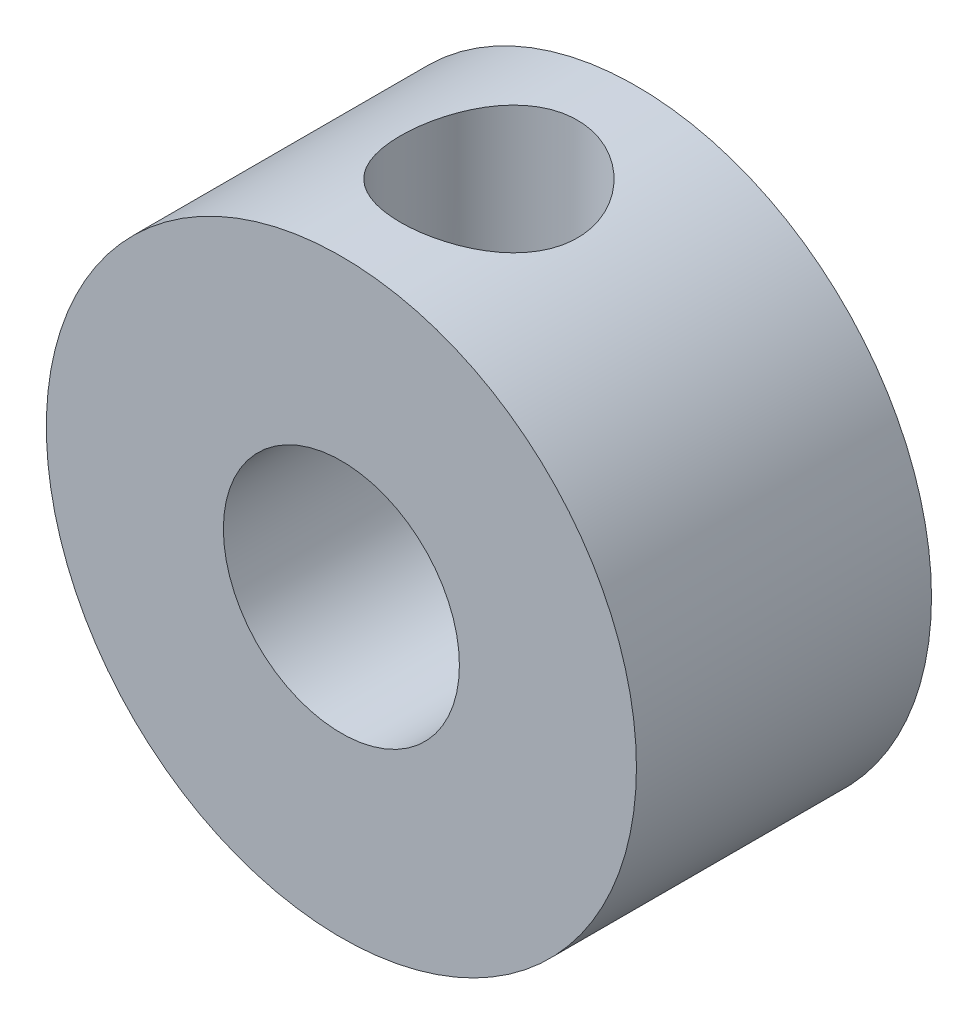
ISO-10303-21;
HEADER;
FILE_DESCRIPTION(('STEP AP214'),'2;1');
FILE_NAME('part.step','',(''),(''),'','','');
FILE_SCHEMA(('AUTOMOTIVE_DESIGN { 1 0 10303 214 1 1 1 1 }'));
ENDSEC;
DATA;
#1=APPLICATION_CONTEXT('core data for automotive mechanical design processes');
#2=APPLICATION_PROTOCOL_DEFINITION('international standard','automotive_design',2000,#1);
#3=PRODUCT_CONTEXT('',#1,'mechanical');
#4=PRODUCT('Part','Part','',(#3));
#5=PRODUCT_RELATED_PRODUCT_CATEGORY('part','',(#4));
#6=PRODUCT_DEFINITION_FORMATION('','',#4);
#7=PRODUCT_DEFINITION_CONTEXT('part definition',#1,'design');
#8=PRODUCT_DEFINITION('design','',#6,#7);
#9=PRODUCT_DEFINITION_SHAPE('','',#8);
#10=(LENGTH_UNIT() NAMED_UNIT(*) SI_UNIT(.MILLI.,.METRE.));
#11=(NAMED_UNIT(*) PLANE_ANGLE_UNIT() SI_UNIT($,.RADIAN.));
#12=(NAMED_UNIT(*) SI_UNIT($,.STERADIAN.) SOLID_ANGLE_UNIT());
#13=UNCERTAINTY_MEASURE_WITH_UNIT(LENGTH_MEASURE(1.E-05),#10,'distance_accuracy_value','');
#14=(GEOMETRIC_REPRESENTATION_CONTEXT(3) GLOBAL_UNCERTAINTY_ASSIGNED_CONTEXT((#13)) GLOBAL_UNIT_ASSIGNED_CONTEXT((#10,
#11,#12)) REPRESENTATION_CONTEXT('',''));
#15=CARTESIAN_POINT('',(0.,0.,0.));
#16=DIRECTION('',(0.,0.,1.));
#17=DIRECTION('',(1.,0.,0.));
#18=AXIS2_PLACEMENT_3D('',#15,#16,#17);
#19=CARTESIAN_POINT('',(0.,0.,2.5));
#20=DIRECTION('',(0.,0.,1.));
#21=DIRECTION('',(1.,0.,0.));
#22=AXIS2_PLACEMENT_3D('',#19,#20,#21);
#23=PLANE('',#22);
#24=CARTESIAN_POINT('',(0.,0.,2.5));
#25=DIRECTION('',(0.,0.,1.));
#26=DIRECTION('',(1.,0.,0.));
#27=AXIS2_PLACEMENT_3D('',#24,#25,#26);
#28=CIRCLE('',#27,5.);
#29=CARTESIAN_POINT('',(5.,0.,2.5));
#30=VERTEX_POINT('',#29);
#31=EDGE_CURVE('E10',#30,#30,#28,.T.);
#32=ORIENTED_EDGE('',*,*,#31,.T.);
#33=EDGE_LOOP('',(#32));
#34=FACE_BOUND('',#33,.T.);
#35=CARTESIAN_POINT('',(0.,0.,2.5));
#36=DIRECTION('',(0.,0.,1.));
#37=DIRECTION('',(1.,0.,0.));
#38=AXIS2_PLACEMENT_3D('',#35,#36,#37);
#39=CIRCLE('',#38,2.);
#40=CARTESIAN_POINT('',(2.,0.,2.5));
#41=VERTEX_POINT('',#40);
#42=EDGE_CURVE('E58',#41,#41,#39,.T.);
#43=ORIENTED_EDGE('',*,*,#42,.F.);
#44=EDGE_LOOP('',(#43));
#45=FACE_BOUND('',#44,.T.);
#46=ADVANCED_FACE('F37',(#34,#45),#23,.T.);
#47=CARTESIAN_POINT('',(0.,0.,-2.5));
#48=DIRECTION('',(0.,0.,1.));
#49=DIRECTION('',(1.,0.,0.));
#50=AXIS2_PLACEMENT_3D('',#47,#48,#49);
#51=PLANE('',#50);
#52=CARTESIAN_POINT('',(0.,0.,-2.5));
#53=DIRECTION('',(0.,0.,1.));
#54=DIRECTION('',(1.,0.,0.));
#55=AXIS2_PLACEMENT_3D('',#52,#53,#54);
#56=CIRCLE('',#55,5.);
#57=CARTESIAN_POINT('',(5.,0.,-2.5));
#58=VERTEX_POINT('',#57);
#59=EDGE_CURVE('E52',#58,#58,#56,.T.);
#60=ORIENTED_EDGE('',*,*,#59,.F.);
#61=EDGE_LOOP('',(#60));
#62=FACE_BOUND('',#61,.T.);
#63=CARTESIAN_POINT('',(0.,0.,-2.5));
#64=DIRECTION('',(0.,0.,1.));
#65=DIRECTION('',(1.,0.,0.));
#66=AXIS2_PLACEMENT_3D('',#63,#64,#65);
#67=CIRCLE('',#66,2.);
#68=CARTESIAN_POINT('',(2.,0.,-2.5));
#69=VERTEX_POINT('',#68);
#70=EDGE_CURVE('E60',#69,#69,#67,.T.);
#71=ORIENTED_EDGE('',*,*,#70,.T.);
#72=EDGE_LOOP('',(#71));
#73=FACE_BOUND('',#72,.T.);
#74=ADVANCED_FACE('F84',(#62,#73),#51,.F.);
#75=CARTESIAN_POINT('',(0.,0.,2.5));
#76=DIRECTION('',(0.,0.,-1.));
#77=DIRECTION('',(-1.,0.,0.));
#78=AXIS2_PLACEMENT_3D('',#75,#76,#77);
#79=CYLINDRICAL_SURFACE('',#78,5.);
#80=CARTESIAN_POINT('',(0.,5.,1.5));
#81=CARTESIAN_POINT('',(-0.0822886127533,4.9999992925055,1.49999900251511));
#82=CARTESIAN_POINT('',(-0.164587318351529,4.99794915693954,1.49320613637603));
#83=CARTESIAN_POINT('',(-0.326788125304881,4.98997105593691,1.4662786457779));
#84=CARTESIAN_POINT('',(-0.40668950441142,4.98404193389692,1.44614004197666));
#85=CARTESIAN_POINT('',(-0.561732707754527,4.96895552501836,1.39325398308974));
#86=CARTESIAN_POINT('',(-0.636881364395373,4.95980300250425,1.36052513038106));
#87=CARTESIAN_POINT('',(-0.780624181053131,4.93922109237645,1.28346390694416));
#88=CARTESIAN_POINT('',(-0.849217467469669,4.92779140192067,1.23912999260458));
#89=CARTESIAN_POINT('',(-0.979871797183745,4.90350737192774,1.13877599252733));
#90=CARTESIAN_POINT('',(-1.04171807124434,4.89062383657036,1.08248337411409));
#91=CARTESIAN_POINT('',(-1.15524920923324,4.86505834210442,0.960390770089816));
#92=CARTESIAN_POINT('',(-1.20693236327441,4.85237641724501,0.89458918787504));
#93=CARTESIAN_POINT('',(-1.29980037723708,4.82834113993772,0.753529246962388));
#94=CARTESIAN_POINT('',(-1.34072309022213,4.81702406663875,0.678091539009262));
#95=CARTESIAN_POINT('',(-1.4092139477476,4.79743620394031,0.521010745769707));
#96=CARTESIAN_POINT('',(-1.43678529919973,4.78916468313311,0.439369156072025));
#97=CARTESIAN_POINT('',(-1.47701633682652,4.77690870838434,0.27460973386954));
#98=CARTESIAN_POINT('',(-1.49007196234677,4.77281069324533,0.191597256136057));
#99=CARTESIAN_POINT('',(-1.50213730614672,4.76902789749767,0.0244668437832341));
#100=CARTESIAN_POINT('',(-1.50115042761078,4.76934204760571,-0.0596508180590879));
#101=CARTESIAN_POINT('',(-1.48546977199812,4.77424744067778,-0.223383908608484));
#102=CARTESIAN_POINT('',(-1.47127205262685,4.7786838859914,-0.303052250362239));
#103=CARTESIAN_POINT('',(-1.43037420427056,4.79108356228624,-0.458819786273461));
#104=CARTESIAN_POINT('',(-1.40367284141641,4.79904714132351,-0.534918627374333));
#105=CARTESIAN_POINT('',(-1.33816026653682,4.81772733074973,-0.68260034966074));
#106=CARTESIAN_POINT('',(-1.29918816934642,4.82848016115952,-0.754107083955263));
#107=CARTESIAN_POINT('',(-1.21035222588683,4.85150987000065,-0.889732022010193));
#108=CARTESIAN_POINT('',(-1.16048574002588,4.86378711746991,-0.953848429413778));
#109=CARTESIAN_POINT('',(-1.04881290765546,4.88911011297937,-1.07568619076202));
#110=CARTESIAN_POINT('',(-0.986594907466972,4.90216654310498,-1.13302866402967));
#111=CARTESIAN_POINT('',(-0.853263259313967,4.92712244063259,-1.23655398406425));
#112=CARTESIAN_POINT('',(-0.782149051860888,4.9390218351841,-1.28273612841443));
#113=CARTESIAN_POINT('',(-0.632355038342803,4.9604316006947,-1.36285992246473));
#114=CARTESIAN_POINT('',(-0.55362774974795,4.96992543668314,-1.39671751624986));
#115=CARTESIAN_POINT('',(-0.391245415603519,4.98533521832222,-1.45059959009963));
#116=CARTESIAN_POINT('',(-0.307591751589581,4.99125216186999,-1.47062792853249));
#117=CARTESIAN_POINT('',(-0.140952242668331,4.99868364643538,-1.49565217789939));
#118=CARTESIAN_POINT('',(-0.0580500976011865,5.0003485041779,-1.50116158580161));
#119=CARTESIAN_POINT('',(0.107499605823384,4.9995292324176,-1.49843084428792));
#120=CARTESIAN_POINT('',(0.190147196690781,4.99704565677756,-1.49019253034856));
#121=CARTESIAN_POINT('',(0.350903605309697,4.98830696987163,-1.4606153888885));
#122=CARTESIAN_POINT('',(0.42907277261417,4.98213829799417,-1.43957661241913));
#123=CARTESIAN_POINT('',(0.580754638954522,4.96674347841533,-1.3853567672218));
#124=CARTESIAN_POINT('',(0.654266777025584,4.95751696321085,-1.35217423896214));
#125=CARTESIAN_POINT('',(0.796437189461053,4.93669654351325,-1.27374683451887));
#126=CARTESIAN_POINT('',(0.86494382619967,4.92505280829675,-1.22824065905203));
#127=CARTESIAN_POINT('',(0.993523307980147,4.90073468764318,-1.12677524594719));
#128=CARTESIAN_POINT('',(1.05359403235593,4.8880600443108,-1.07081338811233));
#129=CARTESIAN_POINT('',(1.16585744551027,4.86253171869138,-0.947612691630654));
#130=CARTESIAN_POINT('',(1.21768481231504,4.84968825033268,-0.880038124228263));
#131=CARTESIAN_POINT('',(1.30928995072154,4.82576515238463,-0.736872060986467));
#132=CARTESIAN_POINT('',(1.34906803829472,4.81468547654651,-0.661280775441785));
#133=CARTESIAN_POINT('',(1.41517347127168,4.79567189615055,-0.504467508745311));
#134=CARTESIAN_POINT('',(1.4415634693705,4.78772337843827,-0.423273813463408));
#135=CARTESIAN_POINT('',(1.48021730815114,4.77591594362794,-0.257312031068522));
#136=CARTESIAN_POINT('',(1.49248598978779,4.772055625083,-0.172545179212331));
#137=CARTESIAN_POINT('',(1.50221984485059,4.76899972496087,-0.00563848162377218));
#138=CARTESIAN_POINT('',(1.5002805530849,4.76961647442754,0.0764636510175859));
#139=CARTESIAN_POINT('',(1.48307505444813,4.77499401288294,0.2391141033728));
#140=CARTESIAN_POINT('',(1.46780938124716,4.77975463592551,0.319662485176353));
#141=CARTESIAN_POINT('',(1.42476888804136,4.79275763670386,0.475945399142852));
#142=CARTESIAN_POINT('',(1.39715175507068,4.80095604545965,0.551727287361693));
#143=CARTESIAN_POINT('',(1.33031507121129,4.81990278909136,0.697642438817723));
#144=CARTESIAN_POINT('',(1.29109329962876,4.83065161194312,0.767774617640757));
#145=CARTESIAN_POINT('',(1.20048763805072,4.85397676425833,0.903163116527113));
#146=CARTESIAN_POINT('',(1.14871276092994,4.86660540163798,0.968148761260412));
#147=CARTESIAN_POINT('',(1.03517434629782,4.89201320450026,1.08870249830786));
#148=CARTESIAN_POINT('',(0.973408217134501,4.90479240823905,1.14426813946776));
#149=CARTESIAN_POINT('',(0.839465762183248,4.92950936570649,1.24602341229503));
#150=CARTESIAN_POINT('',(0.767037885790608,4.94141159765674,1.29189144685549));
#151=CARTESIAN_POINT('',(0.615141373983529,4.96260680455813,1.37073516990403));
#152=CARTESIAN_POINT('',(0.535676052998955,4.97190099931067,1.40371688827451));
#153=CARTESIAN_POINT('',(0.380757712655281,4.98602174969301,1.45289527565275));
#154=CARTESIAN_POINT('',(0.305786961954234,4.99122027381068,1.47051167288325));
#155=CARTESIAN_POINT('',(0.153880195230779,4.99820944494492,1.49406352524158));
#156=CARTESIAN_POINT('',(0.0769445098581396,5.0000006615474,1.50000093270482));
#157=CARTESIAN_POINT('',(0.,5.,1.5));
#158=B_SPLINE_CURVE_WITH_KNOTS('',3,(#80,#81,#82,#83,#84,#85,#86,#87,#88,#89,#90,#91,#92,#93,
#94,#95,#96,#97,#98,#99,#100,#101,#102,#103,#104,#105,#106,#107,#108,#109,#110,#111,#112,#113,
#114,#115,#116,#117,#118,#119,#120,#121,#122,#123,#124,#125,#126,#127,#128,#129,#130,#131,#132,
#133,#134,#135,#136,#137,#138,#139,#140,#141,#142,#143,#144,#145,#146,#147,#148,#149,#150,#151,
#152,#153,#154,#155,#156,#157),.UNSPECIFIED.,.T.,.F.,(4,2,2,2,2,2,2,2,2,2,2,2,2,2,2,2,2,2,2,2,2,
2,2,2,2,2,2,2,2,2,2,2,2,2,2,2,2,2,4),(0.,0.246583203612611,0.493239964846,0.739533676300874,
0.985860164412702,1.23855602948191,1.49129437288633,1.74971481004109,2.00807314543224,
2.25919689356599,2.51025978319089,2.75226016697676,2.99428443658001,3.23962426447119,
3.48502360158555,3.74067104048167,3.99633456531071,4.25371046881689,4.51101453528808,
4.75908809438545,5.00712853550327,5.24956746682327,5.49203554593729,5.74011305702908,
5.98825282000191,6.24540400322818,6.5025484425268,6.75847814951252,7.01432009460283,
7.25950155466943,7.504673196616,7.74680040402721,7.98897397553107,8.23996925679931,
8.49102974897502,8.74942996156671,9.00770911595235,9.23831691930459,9.46888616948874),.UNSPECIFIED.);
#159=CARTESIAN_POINT('',(0.,5.,1.5));
#160=VERTEX_POINT('',#159);
#161=EDGE_CURVE('E64',#160,#160,#158,.T.);
#162=ORIENTED_EDGE('',*,*,#161,.T.);
#163=EDGE_LOOP('',(#162));
#164=FACE_BOUND('',#163,.T.);
#165=ORIENTED_EDGE('',*,*,#31,.F.);
#166=EDGE_LOOP('',(#165));
#167=FACE_BOUND('',#166,.T.);
#168=ORIENTED_EDGE('',*,*,#59,.T.);
#169=EDGE_LOOP('',(#168));
#170=FACE_BOUND('',#169,.T.);
#171=ADVANCED_FACE('F39',(#164,#167,#170),#79,.T.);
#172=CARTESIAN_POINT('',(0.,0.,2.5));
#173=DIRECTION('',(0.,0.,-1.));
#174=DIRECTION('',(-1.,0.,0.));
#175=AXIS2_PLACEMENT_3D('',#172,#173,#174);
#176=CYLINDRICAL_SURFACE('',#175,2.);
#177=CARTESIAN_POINT('',(0.,2.,1.5));
#178=CARTESIAN_POINT('',(-0.0732207358411543,1.99999540196395,1.49999520798798));
#179=CARTESIAN_POINT('',(-0.146561062021485,1.99593645526274,1.4945949756255));
#180=CARTESIAN_POINT('',(-0.290936396286467,1.98006607281083,1.47333293658984));
#181=CARTESIAN_POINT('',(-0.361965136229004,1.96823514679854,1.45744482834995));
#182=CARTESIAN_POINT('',(-0.499234626631249,1.9379567495606,1.41628709071623));
#183=CARTESIAN_POINT('',(-0.565501615403737,1.91954951932009,1.39107448643083));
#184=CARTESIAN_POINT('',(-0.692422335520753,1.87750556721694,1.33245765581277));
#185=CARTESIAN_POINT('',(-0.753077701796332,1.85387037535483,1.29905582580648));
#186=CARTESIAN_POINT('',(-0.873465937590145,1.80049544543983,1.22173698840918));
#187=CARTESIAN_POINT('',(-0.932593229272032,1.77039308548439,1.17713267066593));
#188=CARTESIAN_POINT('',(-1.04302716767671,1.70767017883377,1.08050416263883));
#189=CARTESIAN_POINT('',(-1.09432148272226,1.67504578078609,1.02846851720017));
#190=CARTESIAN_POINT('',(-1.19837161436623,1.6027112365199,0.906417046721634));
#191=CARTESIAN_POINT('',(-1.24930578421204,1.56290854864639,0.834896322878297));
#192=CARTESIAN_POINT('',(-1.33861998176348,1.48711444664135,0.682548987633455));
#193=CARTESIAN_POINT('',(-1.37701716983077,1.45111786883675,0.601735302999691));
#194=CARTESIAN_POINT('',(-1.42880627811788,1.39977155180178,0.460497161323767));
#195=CARTESIAN_POINT('',(-1.44625674456539,1.38157751186733,0.402609302871619));
#196=CARTESIAN_POINT('',(-1.47420672564844,1.35171594150685,0.283607265215081));
#197=CARTESIAN_POINT('',(-1.48472215355267,1.34003347910832,0.22250082212521));
#198=CARTESIAN_POINT('',(-1.49812822141445,1.32503759684552,0.097817414469233));
#199=CARTESIAN_POINT('',(-1.50094954854207,1.32180026676597,0.034223193275946));
#200=CARTESIAN_POINT('',(-1.49848213241869,1.32459531776068,-0.0926149108815732));
#201=CARTESIAN_POINT('',(-1.49319048157349,1.33063102218113,-0.155858660087437));
#202=CARTESIAN_POINT('',(-1.47597739291882,1.34967623262519,-0.27319134742579));
#203=CARTESIAN_POINT('',(-1.46482486380817,1.36187157059871,-0.327536371046183));
#204=CARTESIAN_POINT('',(-1.43705671120733,1.39114192844939,-0.433438878720876));
#205=CARTESIAN_POINT('',(-1.42043583681172,1.40822163640769,-0.484993627823594));
#206=CARTESIAN_POINT('',(-1.37033064172535,1.45741769294306,-0.616256386634148));
#207=CARTESIAN_POINT('',(-1.3328014849398,1.49225649139232,-0.693400416643508));
#208=CARTESIAN_POINT('',(-1.24618023314519,1.56533298145196,-0.839196523869083));
#209=CARTESIAN_POINT('',(-1.19706004255878,1.60357878886109,-0.907827339254659));
#210=CARTESIAN_POINT('',(-1.08651604102135,1.68051672313145,-1.03775339040365));
#211=CARTESIAN_POINT('',(-1.02481375526037,1.71919586730239,-1.09882060688148));
#212=CARTESIAN_POINT('',(-0.890422521709591,1.79248037980972,-1.21026364678116));
#213=CARTESIAN_POINT('',(-0.817755054293757,1.8270934826376,-1.26065992023038));
#214=CARTESIAN_POINT('',(-0.677902080454144,1.88279726073643,-1.33998079924033));
#215=CARTESIAN_POINT('',(-0.612539870185621,1.90520770945008,-1.37118459421578));
#216=CARTESIAN_POINT('',(-0.476352173202088,1.94372904416948,-1.42422488046386));
#217=CARTESIAN_POINT('',(-0.405530141063768,1.95984387504352,-1.44606723849928));
#218=CARTESIAN_POINT('',(-0.25967623248352,1.98445588635989,-1.47925336288644));
#219=CARTESIAN_POINT('',(-0.184621281405944,1.99290592971749,-1.49053217893863));
#220=CARTESIAN_POINT('',(-0.0332012397969186,2.00115883659445,-1.50154959737171));
#221=CARTESIAN_POINT('',(0.043163284372722,2.00096534845408,-1.50129306869537));
#222=CARTESIAN_POINT('',(0.186804217329624,1.99242547175873,-1.48988913072681));
#223=CARTESIAN_POINT('',(0.254222327546132,1.98490086600401,-1.47983946311133));
#224=CARTESIAN_POINT('',(0.386110670609117,1.96351320201588,-1.45102621999213));
#225=CARTESIAN_POINT('',(0.45058027298726,1.94964879507262,-1.43226079031059));
#226=CARTESIAN_POINT('',(0.577416779689768,1.91599830683313,-1.3861124694069));
#227=CARTESIAN_POINT('',(0.639629172536137,1.89602050290193,-1.35844881857261));
#228=CARTESIAN_POINT('',(0.758518527043071,1.85166985411963,-1.29582754457441));
#229=CARTESIAN_POINT('',(0.815194721336401,1.82729640132068,-1.26086891236027));
#230=CARTESIAN_POINT('',(0.931511626319035,1.77119146886499,-1.17821675358944));
#231=CARTESIAN_POINT('',(0.9900667626987,1.73891095025037,-1.12937146056255));
#232=CARTESIAN_POINT('',(1.09871974855854,1.67238952874785,-1.02399124741161));
#233=CARTESIAN_POINT('',(1.14879830469577,1.63814438507395,-0.967439300306643));
#234=CARTESIAN_POINT('',(1.24877541075626,1.56369128291497,-0.835850119038826));
#235=CARTESIAN_POINT('',(1.29683043648705,1.52358718520101,-0.759342438507701));
#236=CARTESIAN_POINT('',(1.37923235998282,1.44940591348451,-0.596639922027549));
#237=CARTESIAN_POINT('',(1.41362000515519,1.41531099570969,-0.510474878091428));
#238=CARTESIAN_POINT('',(1.45615734256767,1.37118877808583,-0.364585551125526));
#239=CARTESIAN_POINT('',(1.46931009512996,1.35695811824565,-0.30760887359762));
#240=CARTESIAN_POINT('',(1.48891522181906,1.33542056103011,-0.191292953016821));
#241=CARTESIAN_POINT('',(1.4953825519924,1.32809821220233,-0.131959293197751));
#242=CARTESIAN_POINT('',(1.50115320209064,1.32157601792209,-0.0121709201886734));
#243=CARTESIAN_POINT('',(1.50042015325262,1.32241740684975,0.0482879430095705));
#244=CARTESIAN_POINT('',(1.49176883838219,1.33216448543666,0.168056838752155));
#245=CARTESIAN_POINT('',(1.48384130024585,1.34108058157484,0.227365287897256));
#246=CARTESIAN_POINT('',(1.45893841819723,1.36817348797773,0.355914571410798));
#247=CARTESIAN_POINT('',(1.44036567954111,1.38794705950643,0.424497180132772));
#248=CARTESIAN_POINT('',(1.39469627266119,1.4338296338541,0.556534848830483));
#249=CARTESIAN_POINT('',(1.3675780729773,1.4599546014693,0.619976442038186));
#250=CARTESIAN_POINT('',(1.29498918933643,1.52516477328823,0.762520630486332));
#251=CARTESIAN_POINT('',(1.2464154206597,1.56560203191105,0.839421582755752));
#252=CARTESIAN_POINT('',(1.13650718465936,1.64713510181273,0.983126044977563));
#253=CARTESIAN_POINT('',(1.07516134758577,1.68823146954222,1.04992046594484));
#254=CARTESIAN_POINT('',(0.939627144937894,1.76728988939793,1.17283184228333));
#255=CARTESIAN_POINT('',(0.865337161562863,1.80522333711072,1.22885631937719));
#256=CARTESIAN_POINT('',(0.705159098936207,1.87357289668097,1.32722305114535));
#257=CARTESIAN_POINT('',(0.619299420401797,1.90400691592959,1.3695979745725));
#258=CARTESIAN_POINT('',(0.464840290356457,1.94636704624048,1.42779942098571));
#259=CARTESIAN_POINT('',(0.398553614774735,1.96110322499718,1.44776673137617));
#260=CARTESIAN_POINT('',(0.262841610392763,1.98383739970238,1.47841790261149));
#261=CARTESIAN_POINT('',(0.193425623834909,1.99185421210894,1.48912769024996));
#262=CARTESIAN_POINT('',(0.102963309861892,1.99745471706309,1.49660469421435));
#263=CARTESIAN_POINT('',(0.0824069459941264,1.9984076143208,1.49787627748942));
#264=CARTESIAN_POINT('',(0.04123688962438,1.99968095423138,1.49957467323097));
#265=CARTESIAN_POINT('',(0.0206231884283889,2.00000129507253,1.50000134970737));
#266=CARTESIAN_POINT('',(0.,2.,1.5));
#267=B_SPLINE_CURVE_WITH_KNOTS('',3,(#177,#178,#179,#180,#181,#182,#183,#184,#185,#186,#187,
#188,#189,#190,#191,#192,#193,#194,#195,#196,#197,#198,#199,#200,#201,#202,#203,#204,#205,#206,
#207,#208,#209,#210,#211,#212,#213,#214,#215,#216,#217,#218,#219,#220,#221,#222,#223,#224,#225,
#226,#227,#228,#229,#230,#231,#232,#233,#234,#235,#236,#237,#238,#239,#240,#241,#242,#243,#244,
#245,#246,#247,#248,#249,#250,#251,#252,#253,#254,#255,#256,#257,#258,#259,#260,#261,#262,#263,
#264,#265,#266),.UNSPECIFIED.,.T.,.F.,(4,2,2,2,2,2,2,2,2,2,2,2,2,2,2,2,2,2,2,2,2,2,2,2,2,2,2,2,
2,2,2,2,2,2,2,2,2,2,2,2,2,2,2,2,4),(0.,0.219571786572042,0.439696319423244,0.658496333573381,
0.877232398849293,1.1162243131743,1.35558868405162,1.64360015887451,1.93121574056507,
2.11999518529902,2.3083399319529,2.49837587621257,2.6884799430021,2.85826890162709,
3.0282213760064,3.3044933180591,3.58144192357889,3.86535883938091,4.14872662493691,
4.37526505006389,4.60166129643117,4.82944058166898,5.05712372466613,5.26191187011994,
5.46674360185812,5.6788043948368,5.89089453977541,6.13840382081868,6.38646908985452,
6.68168596015947,6.97601595850112,7.15589161422933,7.33536399114208,7.51574333854741,
7.69635548563854,7.91639670960134,8.13699685139921,8.43412246655768,8.73151372390893,
9.03135449492649,9.33047220273164,9.5419569754163,9.75284752283256,9.81468166878711,
9.87652576630966),.UNSPECIFIED.);
#268=CARTESIAN_POINT('',(0.,2.,1.5));
#269=VERTEX_POINT('',#268);
#270=EDGE_CURVE('E42',#269,#269,#267,.T.);
#271=ORIENTED_EDGE('',*,*,#270,.F.);
#272=EDGE_LOOP('',(#271));
#273=FACE_BOUND('',#272,.T.);
#274=ORIENTED_EDGE('',*,*,#42,.T.);
#275=EDGE_LOOP('',(#274));
#276=FACE_BOUND('',#275,.T.);
#277=ORIENTED_EDGE('',*,*,#70,.F.);
#278=EDGE_LOOP('',(#277));
#279=FACE_BOUND('',#278,.T.);
#280=ADVANCED_FACE('F76',(#273,#276,#279),#176,.F.);
#281=CARTESIAN_POINT('',(0.,0.,0.));
#282=DIRECTION('',(0.,1.,0.));
#283=DIRECTION('',(0.,0.,1.));
#284=AXIS2_PLACEMENT_3D('',#281,#282,#283);
#285=CYLINDRICAL_SURFACE('',#284,1.5);
#286=ORIENTED_EDGE('',*,*,#270,.T.);
#287=EDGE_LOOP('',(#286));
#288=FACE_BOUND('',#287,.T.);
#289=ORIENTED_EDGE('',*,*,#161,.F.);
#290=EDGE_LOOP('',(#289));
#291=FACE_BOUND('',#290,.T.);
#292=ADVANCED_FACE('F73',(#288,#291),#285,.F.);
#293=CLOSED_SHELL('',(#46,#74,#171,#280,#292));
#294=MANIFOLD_SOLID_BREP('B2',#293);
#295=ADVANCED_BREP_SHAPE_REPRESENTATION('',(#18,#294),#14);
#296=SHAPE_DEFINITION_REPRESENTATION(#9,#295);
ENDSEC;
END-ISO-10303-21;
